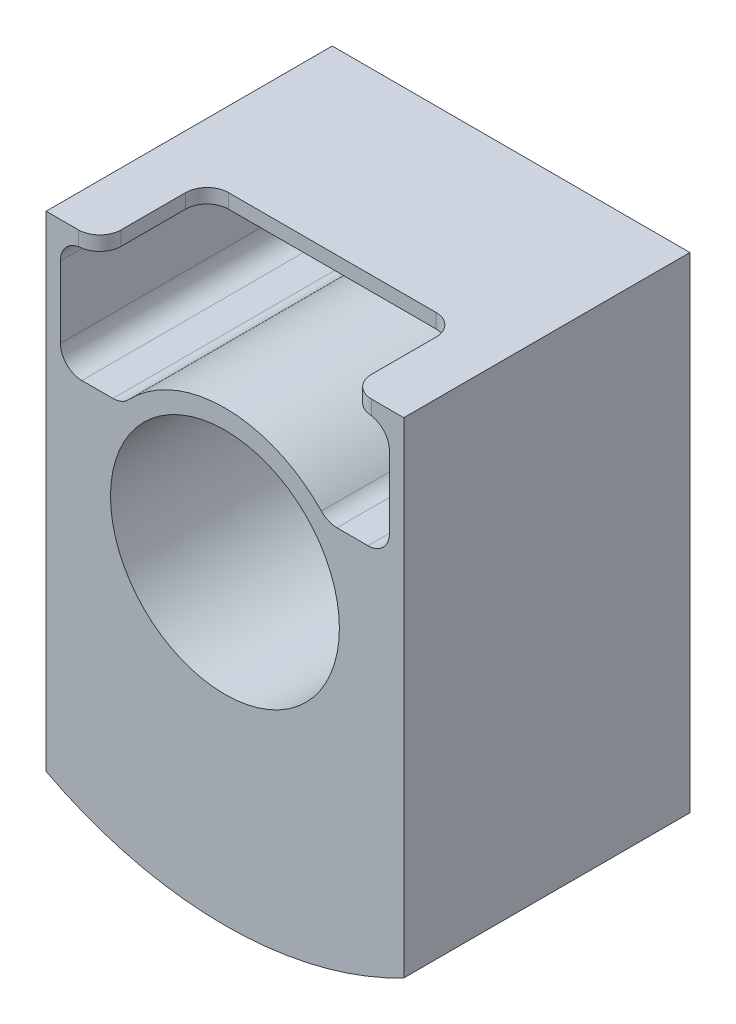
ISO-10303-21;
HEADER;
FILE_DESCRIPTION(('STEP AP214'),'2;1');
FILE_NAME('part.step','',(''),(''),'','','');
FILE_SCHEMA(('AUTOMOTIVE_DESIGN { 1 0 10303 214 1 1 1 1 }'));
ENDSEC;
DATA;
#1=APPLICATION_CONTEXT('core data for automotive mechanical design processes');
#2=APPLICATION_PROTOCOL_DEFINITION('international standard','automotive_design',2000,#1);
#3=PRODUCT_CONTEXT('',#1,'mechanical');
#4=PRODUCT('Part','Part','',(#3));
#5=PRODUCT_RELATED_PRODUCT_CATEGORY('part','',(#4));
#6=PRODUCT_DEFINITION_FORMATION('','',#4);
#7=PRODUCT_DEFINITION_CONTEXT('part definition',#1,'design');
#8=PRODUCT_DEFINITION('design','',#6,#7);
#9=PRODUCT_DEFINITION_SHAPE('','',#8);
#10=(LENGTH_UNIT() NAMED_UNIT(*) SI_UNIT(.MILLI.,.METRE.));
#11=(NAMED_UNIT(*) PLANE_ANGLE_UNIT() SI_UNIT($,.RADIAN.));
#12=(NAMED_UNIT(*) SI_UNIT($,.STERADIAN.) SOLID_ANGLE_UNIT());
#13=UNCERTAINTY_MEASURE_WITH_UNIT(LENGTH_MEASURE(1.E-05),#10,'distance_accuracy_value','');
#14=(GEOMETRIC_REPRESENTATION_CONTEXT(3) GLOBAL_UNCERTAINTY_ASSIGNED_CONTEXT((#13)) GLOBAL_UNIT_ASSIGNED_CONTEXT((#10,
#11,#12)) REPRESENTATION_CONTEXT('',''));
#15=CARTESIAN_POINT('',(0.,0.,0.));
#16=DIRECTION('',(0.,0.,1.));
#17=DIRECTION('',(1.,0.,0.));
#18=AXIS2_PLACEMENT_3D('',#15,#16,#17);
#19=CARTESIAN_POINT('',(-25.,0.,40.));
#20=DIRECTION('',(1.,0.,0.));
#21=DIRECTION('',(0.,1.,0.));
#22=AXIS2_PLACEMENT_3D('',#19,#20,#21);
#23=PLANE('',#22);
#24=DIRECTION('',(0.,-1.,0.));
#25=VECTOR('',#24,1.);
#26=CARTESIAN_POINT('',(-25.,0.,0.));
#27=LINE('',#26,#25);
#28=CARTESIAN_POINT('',(-25.,20.,0.));
#29=VERTEX_POINT('',#28);
#30=CARTESIAN_POINT('',(-25.,-47.8361853098677,0.));
#31=VERTEX_POINT('',#30);
#32=EDGE_CURVE('E225',#29,#31,#27,.T.);
#33=ORIENTED_EDGE('',*,*,#32,.T.);
#34=DIRECTION('',(0.,0.,-1.));
#35=VECTOR('',#34,1.);
#36=CARTESIAN_POINT('',(-25.,-47.8361853098677,40.));
#37=LINE('',#36,#35);
#38=CARTESIAN_POINT('',(-25.,-47.8361853098677,40.));
#39=VERTEX_POINT('',#38);
#40=EDGE_CURVE('E224',#39,#31,#37,.T.);
#41=ORIENTED_EDGE('',*,*,#40,.F.);
#42=DIRECTION('',(0.,-1.,0.));
#43=VECTOR('',#42,1.);
#44=CARTESIAN_POINT('',(-25.,0.,40.));
#45=LINE('',#44,#43);
#46=CARTESIAN_POINT('',(-25.,20.,40.));
#47=VERTEX_POINT('',#46);
#48=EDGE_CURVE('E206',#47,#39,#45,.T.);
#49=ORIENTED_EDGE('',*,*,#48,.F.);
#50=DIRECTION('',(0.,0.,-1.));
#51=VECTOR('',#50,1.);
#52=CARTESIAN_POINT('',(-25.,20.,40.));
#53=LINE('',#52,#51);
#54=EDGE_CURVE('E246',#47,#29,#53,.T.);
#55=ORIENTED_EDGE('',*,*,#54,.T.);
#56=EDGE_LOOP('',(#33,#41,#49,#55));
#57=FACE_BOUND('',#56,.T.);
#58=ADVANCED_FACE('F43',(#57),#23,.F.);
#59=CARTESIAN_POINT('',(0.,0.,40.));
#60=DIRECTION('',(0.,0.,-1.));
#61=DIRECTION('',(-1.,0.,0.));
#62=AXIS2_PLACEMENT_3D('',#59,#60,#61);
#63=CYLINDRICAL_SURFACE('',#62,53.975);
#64=CARTESIAN_POINT('',(0.,0.,0.));
#65=DIRECTION('',(0.,0.,1.));
#66=DIRECTION('',(1.,0.,0.));
#67=AXIS2_PLACEMENT_3D('',#64,#65,#66);
#68=CIRCLE('',#67,53.975);
#69=CARTESIAN_POINT('',(25.,-47.8361853098677,0.));
#70=VERTEX_POINT('',#69);
#71=EDGE_CURVE('E249',#31,#70,#68,.T.);
#72=ORIENTED_EDGE('',*,*,#71,.T.);
#73=DIRECTION('',(0.,0.,-1.));
#74=VECTOR('',#73,1.);
#75=CARTESIAN_POINT('',(25.,-47.8361853098677,40.));
#76=LINE('',#75,#74);
#77=CARTESIAN_POINT('',(25.,-47.8361853098677,40.));
#78=VERTEX_POINT('',#77);
#79=EDGE_CURVE('E231',#78,#70,#76,.T.);
#80=ORIENTED_EDGE('',*,*,#79,.F.);
#81=CARTESIAN_POINT('',(0.,0.,40.));
#82=DIRECTION('',(0.,0.,1.));
#83=DIRECTION('',(1.,0.,0.));
#84=AXIS2_PLACEMENT_3D('',#81,#82,#83);
#85=CIRCLE('',#84,53.975);
#86=EDGE_CURVE('E212',#39,#78,#85,.T.);
#87=ORIENTED_EDGE('',*,*,#86,.F.);
#88=ORIENTED_EDGE('',*,*,#40,.T.);
#89=EDGE_LOOP('',(#72,#80,#87,#88));
#90=FACE_BOUND('',#89,.T.);
#91=ADVANCED_FACE('F233',(#90),#63,.T.);
#92=CARTESIAN_POINT('',(25.,20.,40.));
#93=DIRECTION('',(-1.,0.,0.));
#94=DIRECTION('',(0.,-1.,0.));
#95=AXIS2_PLACEMENT_3D('',#92,#93,#94);
#96=PLANE('',#95);
#97=DIRECTION('',(0.,1.,0.));
#98=VECTOR('',#97,1.);
#99=CARTESIAN_POINT('',(25.,20.,0.));
#100=LINE('',#99,#98);
#101=CARTESIAN_POINT('',(25.,20.,0.));
#102=VERTEX_POINT('',#101);
#103=EDGE_CURVE('E253',#70,#102,#100,.T.);
#104=ORIENTED_EDGE('',*,*,#103,.T.);
#105=DIRECTION('',(0.,0.,-1.));
#106=VECTOR('',#105,1.);
#107=CARTESIAN_POINT('',(25.,20.,40.));
#108=LINE('',#107,#106);
#109=CARTESIAN_POINT('',(25.,20.,40.));
#110=VERTEX_POINT('',#109);
#111=EDGE_CURVE('E261',#110,#102,#108,.T.);
#112=ORIENTED_EDGE('',*,*,#111,.F.);
#113=DIRECTION('',(0.,1.,0.));
#114=VECTOR('',#113,1.);
#115=CARTESIAN_POINT('',(25.,0.,40.));
#116=LINE('',#115,#114);
#117=EDGE_CURVE('E237',#78,#110,#116,.T.);
#118=ORIENTED_EDGE('',*,*,#117,.F.);
#119=ORIENTED_EDGE('',*,*,#79,.T.);
#120=EDGE_LOOP('',(#104,#112,#118,#119));
#121=FACE_BOUND('',#120,.T.);
#122=ADVANCED_FACE('F553',(#121),#96,.F.);
#123=CARTESIAN_POINT('',(-25.,20.,40.));
#124=DIRECTION('',(0.,-1.,0.));
#125=DIRECTION('',(1.,0.,0.));
#126=AXIS2_PLACEMENT_3D('',#123,#124,#125);
#127=PLANE('',#126);
#128=DIRECTION('',(0.,0.,-1.));
#129=VECTOR('',#128,1.);
#130=CARTESIAN_POINT('',(17.5,20.,40.));
#131=LINE('',#130,#129);
#132=CARTESIAN_POINT('',(17.5,20.,37.));
#133=VERTEX_POINT('',#132);
#134=CARTESIAN_POINT('',(17.5,20.,28.));
#135=VERTEX_POINT('',#134);
#136=EDGE_CURVE('E455',#133,#135,#131,.T.);
#137=ORIENTED_EDGE('',*,*,#136,.F.);
#138=CARTESIAN_POINT('',(20.5,20.,37.));
#139=DIRECTION('',(0.,-1.,0.));
#140=DIRECTION('',(1.,0.,0.));
#141=AXIS2_PLACEMENT_3D('',#138,#139,#140);
#142=CIRCLE('',#141,3.);
#143=CARTESIAN_POINT('',(20.5,20.,40.));
#144=VERTEX_POINT('',#143);
#145=EDGE_CURVE('E366',#133,#144,#142,.F.);
#146=ORIENTED_EDGE('',*,*,#145,.T.);
#147=DIRECTION('',(-1.,0.,0.));
#148=VECTOR('',#147,1.);
#149=CARTESIAN_POINT('',(-25.,20.,40.));
#150=LINE('',#149,#148);
#151=EDGE_CURVE('E243',#110,#144,#150,.T.);
#152=ORIENTED_EDGE('',*,*,#151,.F.);
#153=ORIENTED_EDGE('',*,*,#111,.T.);
#154=DIRECTION('',(-1.,0.,0.));
#155=VECTOR('',#154,1.);
#156=CARTESIAN_POINT('',(-25.,20.,0.));
#157=LINE('',#156,#155);
#158=EDGE_CURVE('E221',#102,#29,#157,.T.);
#159=ORIENTED_EDGE('',*,*,#158,.T.);
#160=ORIENTED_EDGE('',*,*,#54,.F.);
#161=CARTESIAN_POINT('',(-20.5,20.,40.));
#162=VERTEX_POINT('',#161);
#163=EDGE_CURVE('E216',#162,#47,#150,.T.);
#164=ORIENTED_EDGE('',*,*,#163,.F.);
#165=CARTESIAN_POINT('',(-20.5,20.,37.));
#166=DIRECTION('',(0.,-1.,0.));
#167=DIRECTION('',(1.,0.,0.));
#168=AXIS2_PLACEMENT_3D('',#165,#166,#167);
#169=CIRCLE('',#168,3.);
#170=CARTESIAN_POINT('',(-17.5,20.,37.));
#171=VERTEX_POINT('',#170);
#172=EDGE_CURVE('E363',#162,#171,#169,.F.);
#173=ORIENTED_EDGE('',*,*,#172,.T.);
#174=DIRECTION('',(0.,0.,1.));
#175=VECTOR('',#174,1.);
#176=CARTESIAN_POINT('',(-17.5,20.,40.));
#177=LINE('',#176,#175);
#178=CARTESIAN_POINT('',(-17.5,20.,28.));
#179=VERTEX_POINT('',#178);
#180=EDGE_CURVE('E441',#179,#171,#177,.T.);
#181=ORIENTED_EDGE('',*,*,#180,.F.);
#182=CARTESIAN_POINT('',(-14.5,20.,28.));
#183=DIRECTION('',(0.,-1.,0.));
#184=DIRECTION('',(1.,0.,0.));
#185=AXIS2_PLACEMENT_3D('',#182,#183,#184);
#186=CIRCLE('',#185,3.);
#187=CARTESIAN_POINT('',(-14.5,20.,25.));
#188=VERTEX_POINT('',#187);
#189=EDGE_CURVE('E53',#179,#188,#186,.T.);
#190=ORIENTED_EDGE('',*,*,#189,.T.);
#191=DIRECTION('',(-1.,0.,0.));
#192=VECTOR('',#191,1.);
#193=CARTESIAN_POINT('',(-17.5,20.,25.));
#194=LINE('',#193,#192);
#195=CARTESIAN_POINT('',(14.5,20.,25.));
#196=VERTEX_POINT('',#195);
#197=EDGE_CURVE('E440',#196,#188,#194,.T.);
#198=ORIENTED_EDGE('',*,*,#197,.F.);
#199=CARTESIAN_POINT('',(14.5,20.,28.));
#200=DIRECTION('',(0.,-1.,0.));
#201=DIRECTION('',(1.,0.,0.));
#202=AXIS2_PLACEMENT_3D('',#199,#200,#201);
#203=CIRCLE('',#202,3.);
#204=EDGE_CURVE('E426',#196,#135,#203,.T.);
#205=ORIENTED_EDGE('',*,*,#204,.T.);
#206=EDGE_LOOP('',(#137,#146,#152,#153,#159,#160,#164,#173,#181,#190,#198,#205));
#207=FACE_BOUND('',#206,.T.);
#208=ADVANCED_FACE('F439',(#207),#127,.F.);
#209=CARTESIAN_POINT('',(0.,0.,40.));
#210=DIRECTION('',(0.,0.,1.));
#211=DIRECTION('',(1.,0.,0.));
#212=AXIS2_PLACEMENT_3D('',#209,#210,#211);
#213=PLANE('',#212);
#214=ORIENTED_EDGE('',*,*,#151,.T.);
#215=DIRECTION('',(0.,1.,0.));
#216=VECTOR('',#215,1.);
#217=CARTESIAN_POINT('',(20.5,18.,40.));
#218=LINE('',#217,#216);
#219=CARTESIAN_POINT('',(20.5,17.9580398915498,40.));
#220=VERTEX_POINT('',#219);
#221=EDGE_CURVE('E372',#144,#220,#218,.F.);
#222=ORIENTED_EDGE('',*,*,#221,.T.);
#223=CARTESIAN_POINT('',(20.,15.,40.));
#224=DIRECTION('',(0.,0.,1.));
#225=DIRECTION('',(1.,0.,0.));
#226=AXIS2_PLACEMENT_3D('',#223,#224,#225);
#227=CIRCLE('',#226,3.);
#228=CARTESIAN_POINT('',(23.,15.,40.));
#229=VERTEX_POINT('',#228);
#230=EDGE_CURVE('E308',#220,#229,#227,.F.);
#231=ORIENTED_EDGE('',*,*,#230,.T.);
#232=DIRECTION('',(0.,1.,0.));
#233=VECTOR('',#232,1.);
#234=CARTESIAN_POINT('',(23.,18.,40.));
#235=LINE('',#234,#233);
#236=CARTESIAN_POINT('',(23.,5.00000000000001,40.));
#237=VERTEX_POINT('',#236);
#238=EDGE_CURVE('E454',#237,#229,#235,.T.);
#239=ORIENTED_EDGE('',*,*,#238,.F.);
#240=CARTESIAN_POINT('',(20.,5.00000000000001,40.));
#241=DIRECTION('',(0.,0.,1.));
#242=DIRECTION('',(1.,0.,0.));
#243=AXIS2_PLACEMENT_3D('',#240,#241,#242);
#244=CIRCLE('',#243,3.);
#245=CARTESIAN_POINT('',(20.,2.00000000000001,40.));
#246=VERTEX_POINT('',#245);
#247=EDGE_CURVE('E314',#237,#246,#244,.F.);
#248=ORIENTED_EDGE('',*,*,#247,.T.);
#249=DIRECTION('',(1.,0.,0.));
#250=VECTOR('',#249,1.);
#251=CARTESIAN_POINT('',(23.,2.00000000000001,40.));
#252=LINE('',#251,#250);
#253=CARTESIAN_POINT('',(15.6553265744799,2.00000000000001,40.));
#254=VERTEX_POINT('',#253);
#255=EDGE_CURVE('E495',#254,#246,#252,.T.);
#256=ORIENTED_EDGE('',*,*,#255,.F.);
#257=CARTESIAN_POINT('',(15.6553265744799,5.00000000000001,40.));
#258=DIRECTION('',(0.,0.,1.));
#259=DIRECTION('',(1.,0.,0.));
#260=AXIS2_PLACEMENT_3D('',#257,#258,#259);
#261=CIRCLE('',#260,3.);
#262=CARTESIAN_POINT('',(13.4891531357993,2.92450183484671,40.));
#263=VERTEX_POINT('',#262);
#264=EDGE_CURVE('E320',#254,#263,#261,.F.);
#265=ORIENTED_EDGE('',*,*,#264,.T.);
#266=CARTESIAN_POINT('',(0.,-9.99999999999999,40.));
#267=DIRECTION('',(0.,0.,-1.));
#268=DIRECTION('',(1.,0.,0.));
#269=AXIS2_PLACEMENT_3D('',#266,#267,#268);
#270=CIRCLE('',#269,18.6815416922694);
#271=CARTESIAN_POINT('',(-13.4891531357993,2.92450183484671,40.));
#272=VERTEX_POINT('',#271);
#273=EDGE_CURVE('E486',#272,#263,#270,.T.);
#274=ORIENTED_EDGE('',*,*,#273,.F.);
#275=CARTESIAN_POINT('',(-15.6553265744799,5.,40.));
#276=DIRECTION('',(0.,0.,1.));
#277=DIRECTION('',(1.,0.,0.));
#278=AXIS2_PLACEMENT_3D('',#275,#276,#277);
#279=CIRCLE('',#278,3.);
#280=CARTESIAN_POINT('',(-15.6553265744799,2.00000000000001,40.));
#281=VERTEX_POINT('',#280);
#282=EDGE_CURVE('E326',#272,#281,#279,.F.);
#283=ORIENTED_EDGE('',*,*,#282,.T.);
#284=DIRECTION('',(1.,0.,0.));
#285=VECTOR('',#284,1.);
#286=CARTESIAN_POINT('',(-23.,2.00000000000001,40.));
#287=LINE('',#286,#285);
#288=CARTESIAN_POINT('',(-20.,2.00000000000001,40.));
#289=VERTEX_POINT('',#288);
#290=EDGE_CURVE('E481',#289,#281,#287,.T.);
#291=ORIENTED_EDGE('',*,*,#290,.F.);
#292=CARTESIAN_POINT('',(-20.,5.00000000000001,40.));
#293=DIRECTION('',(0.,0.,1.));
#294=DIRECTION('',(1.,0.,0.));
#295=AXIS2_PLACEMENT_3D('',#292,#293,#294);
#296=CIRCLE('',#295,3.);
#297=CARTESIAN_POINT('',(-23.,5.,40.));
#298=VERTEX_POINT('',#297);
#299=EDGE_CURVE('E332',#289,#298,#296,.F.);
#300=ORIENTED_EDGE('',*,*,#299,.T.);
#301=DIRECTION('',(0.,-1.,0.));
#302=VECTOR('',#301,1.);
#303=CARTESIAN_POINT('',(-23.,18.,40.));
#304=LINE('',#303,#302);
#305=CARTESIAN_POINT('',(-23.,15.,40.));
#306=VERTEX_POINT('',#305);
#307=EDGE_CURVE('E476',#306,#298,#304,.T.);
#308=ORIENTED_EDGE('',*,*,#307,.F.);
#309=CARTESIAN_POINT('',(-20.,15.,40.));
#310=DIRECTION('',(0.,0.,1.));
#311=DIRECTION('',(1.,0.,0.));
#312=AXIS2_PLACEMENT_3D('',#309,#310,#311);
#313=CIRCLE('',#312,3.);
#314=CARTESIAN_POINT('',(-20.5,17.9580398915498,40.));
#315=VERTEX_POINT('',#314);
#316=EDGE_CURVE('E338',#306,#315,#313,.F.);
#317=ORIENTED_EDGE('',*,*,#316,.T.);
#318=DIRECTION('',(0.,1.,0.));
#319=VECTOR('',#318,1.);
#320=CARTESIAN_POINT('',(-20.5,20.,40.));
#321=LINE('',#320,#319);
#322=EDGE_CURVE('E369',#315,#162,#321,.T.);
#323=ORIENTED_EDGE('',*,*,#322,.T.);
#324=ORIENTED_EDGE('',*,*,#163,.T.);
#325=ORIENTED_EDGE('',*,*,#48,.T.);
#326=ORIENTED_EDGE('',*,*,#86,.T.);
#327=ORIENTED_EDGE('',*,*,#117,.T.);
#328=EDGE_LOOP('',(#214,#222,#231,#239,#248,#256,#265,#274,#283,#291,#300,#308,#317,#323,#324,
#325,#326,#327));
#329=FACE_BOUND('',#328,.T.);
#330=CARTESIAN_POINT('',(0.,-9.99999999999999,40.));
#331=DIRECTION('',(0.,0.,1.));
#332=DIRECTION('',(1.,0.,0.));
#333=AXIS2_PLACEMENT_3D('',#330,#331,#332);
#334=CIRCLE('',#333,16.);
#335=CARTESIAN_POINT('',(16.,-9.99999999999999,40.));
#336=VERTEX_POINT('',#335);
#337=EDGE_CURVE('E502',#336,#336,#334,.T.);
#338=ORIENTED_EDGE('',*,*,#337,.F.);
#339=EDGE_LOOP('',(#338));
#340=FACE_BOUND('',#339,.T.);
#341=ADVANCED_FACE('F209',(#329,#340),#213,.T.);
#342=CARTESIAN_POINT('',(0.,0.,0.));
#343=DIRECTION('',(0.,0.,1.));
#344=DIRECTION('',(1.,0.,0.));
#345=AXIS2_PLACEMENT_3D('',#342,#343,#344);
#346=PLANE('',#345);
#347=CARTESIAN_POINT('',(0.,-9.99999999999999,0.));
#348=DIRECTION('',(0.,0.,-1.));
#349=DIRECTION('',(1.,0.,0.));
#350=AXIS2_PLACEMENT_3D('',#347,#348,#349);
#351=CIRCLE('',#350,18.6815416922694);
#352=CARTESIAN_POINT('',(-13.4891531357993,2.92450183484671,0.));
#353=VERTEX_POINT('',#352);
#354=CARTESIAN_POINT('',(13.4891531357993,2.92450183484671,0.));
#355=VERTEX_POINT('',#354);
#356=EDGE_CURVE('E510',#353,#355,#351,.T.);
#357=ORIENTED_EDGE('',*,*,#356,.T.);
#358=CARTESIAN_POINT('',(15.6553265744799,5.00000000000001,0.));
#359=DIRECTION('',(0.,0.,1.));
#360=DIRECTION('',(1.,0.,0.));
#361=AXIS2_PLACEMENT_3D('',#358,#359,#360);
#362=CIRCLE('',#361,3.);
#363=CARTESIAN_POINT('',(15.6553265744799,2.00000000000001,0.));
#364=VERTEX_POINT('',#363);
#365=EDGE_CURVE('E323',#355,#364,#362,.T.);
#366=ORIENTED_EDGE('',*,*,#365,.T.);
#367=DIRECTION('',(1.,0.,0.));
#368=VECTOR('',#367,1.);
#369=CARTESIAN_POINT('',(23.,2.00000000000001,0.));
#370=LINE('',#369,#368);
#371=CARTESIAN_POINT('',(20.,2.00000000000001,0.));
#372=VERTEX_POINT('',#371);
#373=EDGE_CURVE('E505',#364,#372,#370,.T.);
#374=ORIENTED_EDGE('',*,*,#373,.T.);
#375=CARTESIAN_POINT('',(20.,5.00000000000001,0.));
#376=DIRECTION('',(0.,0.,1.));
#377=DIRECTION('',(1.,0.,0.));
#378=AXIS2_PLACEMENT_3D('',#375,#376,#377);
#379=CIRCLE('',#378,3.);
#380=CARTESIAN_POINT('',(23.,5.00000000000001,0.));
#381=VERTEX_POINT('',#380);
#382=EDGE_CURVE('E317',#372,#381,#379,.T.);
#383=ORIENTED_EDGE('',*,*,#382,.T.);
#384=DIRECTION('',(0.,1.,0.));
#385=VECTOR('',#384,1.);
#386=CARTESIAN_POINT('',(23.,18.,0.));
#387=LINE('',#386,#385);
#388=CARTESIAN_POINT('',(23.,15.,0.));
#389=VERTEX_POINT('',#388);
#390=EDGE_CURVE('E499',#381,#389,#387,.T.);
#391=ORIENTED_EDGE('',*,*,#390,.T.);
#392=CARTESIAN_POINT('',(20.,15.,0.));
#393=DIRECTION('',(0.,0.,1.));
#394=DIRECTION('',(1.,0.,0.));
#395=AXIS2_PLACEMENT_3D('',#392,#393,#394);
#396=CIRCLE('',#395,3.);
#397=CARTESIAN_POINT('',(20.,18.,0.));
#398=VERTEX_POINT('',#397);
#399=EDGE_CURVE('E311',#389,#398,#396,.T.);
#400=ORIENTED_EDGE('',*,*,#399,.T.);
#401=DIRECTION('',(-1.,0.,0.));
#402=VECTOR('',#401,1.);
#403=CARTESIAN_POINT('',(-23.,18.,0.));
#404=LINE('',#403,#402);
#405=CARTESIAN_POINT('',(-20.,18.,0.));
#406=VERTEX_POINT('',#405);
#407=EDGE_CURVE('E526',#398,#406,#404,.T.);
#408=ORIENTED_EDGE('',*,*,#407,.T.);
#409=CARTESIAN_POINT('',(-20.,15.,0.));
#410=DIRECTION('',(0.,0.,1.));
#411=DIRECTION('',(1.,0.,0.));
#412=AXIS2_PLACEMENT_3D('',#409,#410,#411);
#413=CIRCLE('',#412,3.);
#414=CARTESIAN_POINT('',(-23.,15.,0.));
#415=VERTEX_POINT('',#414);
#416=EDGE_CURVE('E342',#406,#415,#413,.T.);
#417=ORIENTED_EDGE('',*,*,#416,.T.);
#418=DIRECTION('',(0.,-1.,0.));
#419=VECTOR('',#418,1.);
#420=CARTESIAN_POINT('',(-23.,18.,0.));
#421=LINE('',#420,#419);
#422=CARTESIAN_POINT('',(-23.,5.,0.));
#423=VERTEX_POINT('',#422);
#424=EDGE_CURVE('E522',#415,#423,#421,.T.);
#425=ORIENTED_EDGE('',*,*,#424,.T.);
#426=CARTESIAN_POINT('',(-20.,5.00000000000001,0.));
#427=DIRECTION('',(0.,0.,1.));
#428=DIRECTION('',(1.,0.,0.));
#429=AXIS2_PLACEMENT_3D('',#426,#427,#428);
#430=CIRCLE('',#429,3.);
#431=CARTESIAN_POINT('',(-20.,2.00000000000001,0.));
#432=VERTEX_POINT('',#431);
#433=EDGE_CURVE('E335',#423,#432,#430,.T.);
#434=ORIENTED_EDGE('',*,*,#433,.T.);
#435=DIRECTION('',(1.,0.,0.));
#436=VECTOR('',#435,1.);
#437=CARTESIAN_POINT('',(-23.,2.00000000000001,0.));
#438=LINE('',#437,#436);
#439=CARTESIAN_POINT('',(-15.6553265744799,2.00000000000001,0.));
#440=VERTEX_POINT('',#439);
#441=EDGE_CURVE('E516',#432,#440,#438,.T.);
#442=ORIENTED_EDGE('',*,*,#441,.T.);
#443=CARTESIAN_POINT('',(-15.6553265744799,5.,0.));
#444=DIRECTION('',(0.,0.,1.));
#445=DIRECTION('',(1.,0.,0.));
#446=AXIS2_PLACEMENT_3D('',#443,#444,#445);
#447=CIRCLE('',#446,3.);
#448=EDGE_CURVE('E329',#440,#353,#447,.T.);
#449=ORIENTED_EDGE('',*,*,#448,.T.);
#450=EDGE_LOOP('',(#357,#366,#374,#383,#391,#400,#408,#417,#425,#434,#442,#449));
#451=FACE_BOUND('',#450,.T.);
#452=CARTESIAN_POINT('',(0.,-9.99999999999999,0.));
#453=DIRECTION('',(0.,0.,1.));
#454=DIRECTION('',(1.,0.,0.));
#455=AXIS2_PLACEMENT_3D('',#452,#453,#454);
#456=CIRCLE('',#455,16.);
#457=CARTESIAN_POINT('',(16.,-9.99999999999999,0.));
#458=VERTEX_POINT('',#457);
#459=EDGE_CURVE('E250',#458,#458,#456,.T.);
#460=ORIENTED_EDGE('',*,*,#459,.T.);
#461=EDGE_LOOP('',(#460));
#462=FACE_BOUND('',#461,.T.);
#463=ORIENTED_EDGE('',*,*,#32,.F.);
#464=ORIENTED_EDGE('',*,*,#158,.F.);
#465=ORIENTED_EDGE('',*,*,#103,.F.);
#466=ORIENTED_EDGE('',*,*,#71,.F.);
#467=EDGE_LOOP('',(#463,#464,#465,#466));
#468=FACE_BOUND('',#467,.T.);
#469=ADVANCED_FACE('F556',(#451,#462,#468),#346,.F.);
#470=CARTESIAN_POINT('',(0.,-9.99999999999999,0.));
#471=DIRECTION('',(0.,0.,1.));
#472=DIRECTION('',(1.,0.,0.));
#473=AXIS2_PLACEMENT_3D('',#470,#471,#472);
#474=CYLINDRICAL_SURFACE('',#473,16.);
#475=ORIENTED_EDGE('',*,*,#459,.F.);
#476=EDGE_LOOP('',(#475));
#477=FACE_BOUND('',#476,.T.);
#478=ORIENTED_EDGE('',*,*,#337,.T.);
#479=EDGE_LOOP('',(#478));
#480=FACE_BOUND('',#479,.T.);
#481=ADVANCED_FACE('F558',(#477,#480),#474,.F.);
#482=CARTESIAN_POINT('',(23.,18.,0.));
#483=DIRECTION('',(1.,0.,0.));
#484=DIRECTION('',(0.,1.,0.));
#485=AXIS2_PLACEMENT_3D('',#482,#483,#484);
#486=PLANE('',#485);
#487=ORIENTED_EDGE('',*,*,#238,.T.);
#488=DIRECTION('',(0.,0.,1.));
#489=VECTOR('',#488,1.);
#490=CARTESIAN_POINT('',(23.,15.,0.));
#491=LINE('',#490,#489);
#492=EDGE_CURVE('E277',#229,#389,#491,.F.);
#493=ORIENTED_EDGE('',*,*,#492,.T.);
#494=ORIENTED_EDGE('',*,*,#390,.F.);
#495=DIRECTION('',(0.,0.,1.));
#496=VECTOR('',#495,1.);
#497=CARTESIAN_POINT('',(23.,5.00000000000001,40.));
#498=LINE('',#497,#496);
#499=EDGE_CURVE('E273',#381,#237,#498,.T.);
#500=ORIENTED_EDGE('',*,*,#499,.T.);
#501=EDGE_LOOP('',(#487,#493,#494,#500));
#502=FACE_BOUND('',#501,.T.);
#503=ADVANCED_FACE('F564',(#502),#486,.F.);
#504=CARTESIAN_POINT('',(23.,2.00000000000001,0.));
#505=DIRECTION('',(0.,-1.,0.));
#506=DIRECTION('',(0.,0.,-1.));
#507=AXIS2_PLACEMENT_3D('',#504,#505,#506);
#508=PLANE('',#507);
#509=ORIENTED_EDGE('',*,*,#255,.T.);
#510=DIRECTION('',(0.,0.,1.));
#511=VECTOR('',#510,1.);
#512=CARTESIAN_POINT('',(20.,2.00000000000001,0.));
#513=LINE('',#512,#511);
#514=EDGE_CURVE('E284',#246,#372,#513,.F.);
#515=ORIENTED_EDGE('',*,*,#514,.T.);
#516=ORIENTED_EDGE('',*,*,#373,.F.);
#517=DIRECTION('',(0.,0.,-1.));
#518=VECTOR('',#517,1.);
#519=CARTESIAN_POINT('',(15.6553265744799,2.00000000000001,40.));
#520=LINE('',#519,#518);
#521=EDGE_CURVE('E280',#364,#254,#520,.F.);
#522=ORIENTED_EDGE('',*,*,#521,.T.);
#523=EDGE_LOOP('',(#509,#515,#516,#522));
#524=FACE_BOUND('',#523,.T.);
#525=ADVANCED_FACE('F734',(#524),#508,.F.);
#526=CARTESIAN_POINT('',(0.,-9.99999999999999,0.));
#527=DIRECTION('',(0.,0.,1.));
#528=DIRECTION('',(1.,0.,0.));
#529=AXIS2_PLACEMENT_3D('',#526,#527,#528);
#530=CYLINDRICAL_SURFACE('',#529,18.6815416922694);
#531=ORIENTED_EDGE('',*,*,#273,.T.);
#532=DIRECTION('',(0.,0.,1.));
#533=VECTOR('',#532,1.);
#534=CARTESIAN_POINT('',(13.4891531357993,2.92450183484671,0.));
#535=LINE('',#534,#533);
#536=EDGE_CURVE('E291',#263,#355,#535,.F.);
#537=ORIENTED_EDGE('',*,*,#536,.T.);
#538=ORIENTED_EDGE('',*,*,#356,.F.);
#539=DIRECTION('',(0.,0.,1.));
#540=VECTOR('',#539,1.);
#541=CARTESIAN_POINT('',(-13.4891531357993,2.92450183484671,0.));
#542=LINE('',#541,#540);
#543=EDGE_CURVE('E287',#353,#272,#542,.T.);
#544=ORIENTED_EDGE('',*,*,#543,.T.);
#545=EDGE_LOOP('',(#531,#537,#538,#544));
#546=FACE_BOUND('',#545,.T.);
#547=ADVANCED_FACE('F724',(#546),#530,.T.);
#548=CARTESIAN_POINT('',(-23.,2.00000000000001,0.));
#549=DIRECTION('',(0.,-1.,0.));
#550=DIRECTION('',(0.,0.,-1.));
#551=AXIS2_PLACEMENT_3D('',#548,#549,#550);
#552=PLANE('',#551);
#553=ORIENTED_EDGE('',*,*,#290,.T.);
#554=DIRECTION('',(0.,0.,-1.));
#555=VECTOR('',#554,1.);
#556=CARTESIAN_POINT('',(-15.6553265744799,2.00000000000001,0.));
#557=LINE('',#556,#555);
#558=EDGE_CURVE('E298',#281,#440,#557,.T.);
#559=ORIENTED_EDGE('',*,*,#558,.T.);
#560=ORIENTED_EDGE('',*,*,#441,.F.);
#561=DIRECTION('',(0.,0.,1.));
#562=VECTOR('',#561,1.);
#563=CARTESIAN_POINT('',(-20.,2.00000000000001,40.));
#564=LINE('',#563,#562);
#565=EDGE_CURVE('E294',#432,#289,#564,.T.);
#566=ORIENTED_EDGE('',*,*,#565,.T.);
#567=EDGE_LOOP('',(#553,#559,#560,#566));
#568=FACE_BOUND('',#567,.T.);
#569=ADVANCED_FACE('F715',(#568),#552,.F.);
#570=CARTESIAN_POINT('',(-23.,18.,0.));
#571=DIRECTION('',(-1.,0.,0.));
#572=DIRECTION('',(0.,-1.,0.));
#573=AXIS2_PLACEMENT_3D('',#570,#571,#572);
#574=PLANE('',#573);
#575=ORIENTED_EDGE('',*,*,#307,.T.);
#576=DIRECTION('',(0.,0.,1.));
#577=VECTOR('',#576,1.);
#578=CARTESIAN_POINT('',(-23.,5.,0.));
#579=LINE('',#578,#577);
#580=EDGE_CURVE('E305',#298,#423,#579,.F.);
#581=ORIENTED_EDGE('',*,*,#580,.T.);
#582=ORIENTED_EDGE('',*,*,#424,.F.);
#583=DIRECTION('',(0.,0.,1.));
#584=VECTOR('',#583,1.);
#585=CARTESIAN_POINT('',(-23.,15.,40.));
#586=LINE('',#585,#584);
#587=EDGE_CURVE('E301',#415,#306,#586,.T.);
#588=ORIENTED_EDGE('',*,*,#587,.T.);
#589=EDGE_LOOP('',(#575,#581,#582,#588));
#590=FACE_BOUND('',#589,.T.);
#591=ADVANCED_FACE('F599',(#590),#574,.F.);
#592=CARTESIAN_POINT('',(-23.,18.,0.));
#593=DIRECTION('',(0.,1.,0.));
#594=DIRECTION('',(-1.,0.,0.));
#595=AXIS2_PLACEMENT_3D('',#592,#593,#594);
#596=PLANE('',#595);
#597=DIRECTION('',(0.,0.,1.));
#598=VECTOR('',#597,1.);
#599=CARTESIAN_POINT('',(20.,18.,40.));
#600=LINE('',#599,#598);
#601=CARTESIAN_POINT('',(20.,18.,39.9580398915498));
#602=VERTEX_POINT('',#601);
#603=EDGE_CURVE('E269',#398,#602,#600,.T.);
#604=ORIENTED_EDGE('',*,*,#603,.T.);
#605=CARTESIAN_POINT('',(20.5,18.,37.));
#606=DIRECTION('',(0.,1.,0.));
#607=DIRECTION('',(-1.,0.,0.));
#608=AXIS2_PLACEMENT_3D('',#605,#606,#607);
#609=CIRCLE('',#608,3.);
#610=CARTESIAN_POINT('',(17.5,18.,37.));
#611=VERTEX_POINT('',#610);
#612=EDGE_CURVE('E460',#602,#611,#609,.F.);
#613=ORIENTED_EDGE('',*,*,#612,.T.);
#614=DIRECTION('',(0.,0.,-1.));
#615=VECTOR('',#614,1.);
#616=CARTESIAN_POINT('',(17.5,18.,0.));
#617=LINE('',#616,#615);
#618=CARTESIAN_POINT('',(17.5,18.,28.));
#619=VERTEX_POINT('',#618);
#620=EDGE_CURVE('E345',#611,#619,#617,.T.);
#621=ORIENTED_EDGE('',*,*,#620,.T.);
#622=CARTESIAN_POINT('',(14.5,18.,28.));
#623=DIRECTION('',(0.,1.,0.));
#624=DIRECTION('',(-1.,0.,0.));
#625=AXIS2_PLACEMENT_3D('',#622,#623,#624);
#626=CIRCLE('',#625,3.);
#627=CARTESIAN_POINT('',(14.5,18.,25.));
#628=VERTEX_POINT('',#627);
#629=EDGE_CURVE('E431',#619,#628,#626,.T.);
#630=ORIENTED_EDGE('',*,*,#629,.T.);
#631=DIRECTION('',(-1.,0.,0.));
#632=VECTOR('',#631,1.);
#633=CARTESIAN_POINT('',(-23.,18.,25.));
#634=LINE('',#633,#632);
#635=CARTESIAN_POINT('',(-14.5,18.,25.));
#636=VERTEX_POINT('',#635);
#637=EDGE_CURVE('E349',#628,#636,#634,.T.);
#638=ORIENTED_EDGE('',*,*,#637,.T.);
#639=CARTESIAN_POINT('',(-14.5,18.,28.));
#640=DIRECTION('',(0.,1.,0.));
#641=DIRECTION('',(-1.,0.,0.));
#642=AXIS2_PLACEMENT_3D('',#639,#640,#641);
#643=CIRCLE('',#642,3.);
#644=CARTESIAN_POINT('',(-17.5,18.,28.));
#645=VERTEX_POINT('',#644);
#646=EDGE_CURVE('E11',#636,#645,#643,.T.);
#647=ORIENTED_EDGE('',*,*,#646,.T.);
#648=DIRECTION('',(0.,0.,1.));
#649=VECTOR('',#648,1.);
#650=CARTESIAN_POINT('',(-17.5,18.,0.));
#651=LINE('',#650,#649);
#652=CARTESIAN_POINT('',(-17.5,18.,37.));
#653=VERTEX_POINT('',#652);
#654=EDGE_CURVE('E353',#645,#653,#651,.T.);
#655=ORIENTED_EDGE('',*,*,#654,.T.);
#656=CARTESIAN_POINT('',(-20.5,18.,37.));
#657=DIRECTION('',(0.,1.,0.));
#658=DIRECTION('',(-1.,0.,0.));
#659=AXIS2_PLACEMENT_3D('',#656,#657,#658);
#660=CIRCLE('',#659,3.);
#661=CARTESIAN_POINT('',(-20.,18.,39.9580398915498));
#662=VERTEX_POINT('',#661);
#663=EDGE_CURVE('E60',#653,#662,#660,.F.);
#664=ORIENTED_EDGE('',*,*,#663,.T.);
#665=DIRECTION('',(0.,0.,1.));
#666=VECTOR('',#665,1.);
#667=CARTESIAN_POINT('',(-20.,18.,0.));
#668=LINE('',#667,#666);
#669=EDGE_CURVE('E230',#662,#406,#668,.F.);
#670=ORIENTED_EDGE('',*,*,#669,.T.);
#671=ORIENTED_EDGE('',*,*,#407,.F.);
#672=EDGE_LOOP('',(#604,#613,#621,#630,#638,#647,#655,#664,#670,#671));
#673=FACE_BOUND('',#672,.T.);
#674=ADVANCED_FACE('F395',(#673),#596,.F.);
#675=CARTESIAN_POINT('',(20.,15.,0.));
#676=DIRECTION('',(0.,0.,-1.));
#677=DIRECTION('',(-1.,0.,0.));
#678=AXIS2_PLACEMENT_3D('',#675,#676,#677);
#679=CYLINDRICAL_SURFACE('',#678,3.);
#680=ORIENTED_EDGE('',*,*,#230,.F.);
#681=CARTESIAN_POINT('',(20.5,17.9580398915498,40.));
#682=CARTESIAN_POINT('',(20.4584594430555,17.9650641757042,40.0000025812563));
#683=CARTESIAN_POINT('',(20.4167694528085,17.971208357173,39.9991371821036));
#684=CARTESIAN_POINT('',(20.3333859621343,17.9817125143252,39.9956587052855));
#685=CARTESIAN_POINT('',(20.2916929810671,17.9860786380353,39.9930517335154));
#686=CARTESIAN_POINT('',(20.2083070189329,17.9930517335154,39.9860786380353));
#687=CARTESIAN_POINT('',(20.1666140378657,17.9956587052855,39.9817125143252));
#688=CARTESIAN_POINT('',(20.0832305471915,17.9991371821036,39.971208357173));
#689=CARTESIAN_POINT('',(20.0415405569445,18.0000025812563,39.9650641757042));
#690=CARTESIAN_POINT('',(20.,18.,39.9580398915498));
#691=B_SPLINE_CURVE_WITH_KNOTS('',3,(#681,#682,#683,#684,#685,#686,#687,#688,#689,#690),
.UNSPECIFIED.,.F.,.F.,(4,2,2,2,4),(0.,0.126373343615947,0.252305935630919,0.378238527645888,
0.504611871261836),.UNSPECIFIED.);
#692=EDGE_CURVE('E375',#220,#602,#691,.T.);
#693=ORIENTED_EDGE('',*,*,#692,.T.);
#694=ORIENTED_EDGE('',*,*,#603,.F.);
#695=ORIENTED_EDGE('',*,*,#399,.F.);
#696=ORIENTED_EDGE('',*,*,#492,.F.);
#697=EDGE_LOOP('',(#680,#693,#694,#695,#696));
#698=FACE_BOUND('',#697,.T.);
#699=ADVANCED_FACE('F389',(#698),#679,.F.);
#700=CARTESIAN_POINT('',(20.,5.00000000000001,0.));
#701=DIRECTION('',(0.,0.,-1.));
#702=DIRECTION('',(-1.,0.,0.));
#703=AXIS2_PLACEMENT_3D('',#700,#701,#702);
#704=CYLINDRICAL_SURFACE('',#703,3.);
#705=ORIENTED_EDGE('',*,*,#382,.F.);
#706=ORIENTED_EDGE('',*,*,#514,.F.);
#707=ORIENTED_EDGE('',*,*,#247,.F.);
#708=ORIENTED_EDGE('',*,*,#499,.F.);
#709=EDGE_LOOP('',(#705,#706,#707,#708));
#710=FACE_BOUND('',#709,.T.);
#711=ADVANCED_FACE('F394',(#710),#704,.F.);
#712=CARTESIAN_POINT('',(15.6553265744799,5.00000000000001,0.));
#713=DIRECTION('',(0.,0.,1.));
#714=DIRECTION('',(1.,0.,0.));
#715=AXIS2_PLACEMENT_3D('',#712,#713,#714);
#716=CYLINDRICAL_SURFACE('',#715,3.);
#717=ORIENTED_EDGE('',*,*,#365,.F.);
#718=ORIENTED_EDGE('',*,*,#536,.F.);
#719=ORIENTED_EDGE('',*,*,#264,.F.);
#720=ORIENTED_EDGE('',*,*,#521,.F.);
#721=EDGE_LOOP('',(#717,#718,#719,#720));
#722=FACE_BOUND('',#721,.T.);
#723=ADVANCED_FACE('F400',(#722),#716,.F.);
#724=CARTESIAN_POINT('',(-15.6553265744799,5.,0.));
#725=DIRECTION('',(0.,0.,1.));
#726=DIRECTION('',(1.,0.,0.));
#727=AXIS2_PLACEMENT_3D('',#724,#725,#726);
#728=CYLINDRICAL_SURFACE('',#727,3.);
#729=ORIENTED_EDGE('',*,*,#448,.F.);
#730=ORIENTED_EDGE('',*,*,#558,.F.);
#731=ORIENTED_EDGE('',*,*,#282,.F.);
#732=ORIENTED_EDGE('',*,*,#543,.F.);
#733=EDGE_LOOP('',(#729,#730,#731,#732));
#734=FACE_BOUND('',#733,.T.);
#735=ADVANCED_FACE('F404',(#734),#728,.F.);
#736=CARTESIAN_POINT('',(-20.,5.00000000000001,0.));
#737=DIRECTION('',(0.,0.,-1.));
#738=DIRECTION('',(-1.,0.,0.));
#739=AXIS2_PLACEMENT_3D('',#736,#737,#738);
#740=CYLINDRICAL_SURFACE('',#739,3.);
#741=ORIENTED_EDGE('',*,*,#433,.F.);
#742=ORIENTED_EDGE('',*,*,#580,.F.);
#743=ORIENTED_EDGE('',*,*,#299,.F.);
#744=ORIENTED_EDGE('',*,*,#565,.F.);
#745=EDGE_LOOP('',(#741,#742,#743,#744));
#746=FACE_BOUND('',#745,.T.);
#747=ADVANCED_FACE('F408',(#746),#740,.F.);
#748=CARTESIAN_POINT('',(-20.,15.,0.));
#749=DIRECTION('',(0.,0.,-1.));
#750=DIRECTION('',(-1.,0.,0.));
#751=AXIS2_PLACEMENT_3D('',#748,#749,#750);
#752=CYLINDRICAL_SURFACE('',#751,3.);
#753=ORIENTED_EDGE('',*,*,#669,.F.);
#754=CARTESIAN_POINT('',(-20.,18.,39.9580398915498));
#755=CARTESIAN_POINT('',(-20.0415405569445,18.0000025812563,39.9650641757042));
#756=CARTESIAN_POINT('',(-20.0832305471915,17.9991371821036,39.971208357173));
#757=CARTESIAN_POINT('',(-20.1666140378657,17.9956587052855,39.9817125143252));
#758=CARTESIAN_POINT('',(-20.2083070189329,17.9930517335154,39.9860786380353));
#759=CARTESIAN_POINT('',(-20.2916929810671,17.9860786380353,39.9930517335154));
#760=CARTESIAN_POINT('',(-20.3333859621343,17.9817125143252,39.9956587052855));
#761=CARTESIAN_POINT('',(-20.4167694528085,17.971208357173,39.9991371821036));
#762=CARTESIAN_POINT('',(-20.4584594430556,17.9650641757042,40.0000025812563));
#763=CARTESIAN_POINT('',(-20.5,17.9580398915498,40.));
#764=B_SPLINE_CURVE_WITH_KNOTS('',3,(#754,#755,#756,#757,#758,#759,#760,#761,#762,#763),
.UNSPECIFIED.,.F.,.F.,(4,2,2,2,4),(0.,0.126373343615954,0.252305935630927,0.378238527645898,
0.504611871261849),.UNSPECIFIED.);
#765=EDGE_CURVE('E418',#662,#315,#764,.T.);
#766=ORIENTED_EDGE('',*,*,#765,.T.);
#767=ORIENTED_EDGE('',*,*,#316,.F.);
#768=ORIENTED_EDGE('',*,*,#587,.F.);
#769=ORIENTED_EDGE('',*,*,#416,.F.);
#770=EDGE_LOOP('',(#753,#766,#767,#768,#769));
#771=FACE_BOUND('',#770,.T.);
#772=ADVANCED_FACE('F411',(#771),#752,.F.);
#773=CARTESIAN_POINT('',(-17.5,10.,40.));
#774=DIRECTION('',(-1.,0.,0.));
#775=DIRECTION('',(0.,-1.,0.));
#776=AXIS2_PLACEMENT_3D('',#773,#774,#775);
#777=PLANE('',#776);
#778=ORIENTED_EDGE('',*,*,#654,.F.);
#779=DIRECTION('',(0.,1.,0.));
#780=VECTOR('',#779,1.);
#781=CARTESIAN_POINT('',(-17.5,20.,28.));
#782=LINE('',#781,#780);
#783=EDGE_CURVE('E427',#645,#179,#782,.T.);
#784=ORIENTED_EDGE('',*,*,#783,.T.);
#785=ORIENTED_EDGE('',*,*,#180,.T.);
#786=DIRECTION('',(0.,1.,0.));
#787=VECTOR('',#786,1.);
#788=CARTESIAN_POINT('',(-17.5,18.,37.));
#789=LINE('',#788,#787);
#790=EDGE_CURVE('E68',#171,#653,#789,.F.);
#791=ORIENTED_EDGE('',*,*,#790,.T.);
#792=EDGE_LOOP('',(#778,#784,#785,#791));
#793=FACE_BOUND('',#792,.T.);
#794=ADVANCED_FACE('F415',(#793),#777,.F.);
#795=CARTESIAN_POINT('',(-17.5,10.,25.));
#796=DIRECTION('',(0.,0.,-1.));
#797=DIRECTION('',(-1.,0.,0.));
#798=AXIS2_PLACEMENT_3D('',#795,#796,#797);
#799=PLANE('',#798);
#800=ORIENTED_EDGE('',*,*,#637,.F.);
#801=DIRECTION('',(0.,1.,0.));
#802=VECTOR('',#801,1.);
#803=CARTESIAN_POINT('',(14.5,20.,25.));
#804=LINE('',#803,#802);
#805=EDGE_CURVE('E452',#628,#196,#804,.T.);
#806=ORIENTED_EDGE('',*,*,#805,.T.);
#807=ORIENTED_EDGE('',*,*,#197,.T.);
#808=DIRECTION('',(0.,1.,0.));
#809=VECTOR('',#808,1.);
#810=CARTESIAN_POINT('',(-14.5,18.,25.));
#811=LINE('',#810,#809);
#812=EDGE_CURVE('E450',#188,#636,#811,.F.);
#813=ORIENTED_EDGE('',*,*,#812,.T.);
#814=EDGE_LOOP('',(#800,#806,#807,#813));
#815=FACE_BOUND('',#814,.T.);
#816=ADVANCED_FACE('F449',(#815),#799,.F.);
#817=CARTESIAN_POINT('',(17.5,10.,40.));
#818=DIRECTION('',(1.,0.,0.));
#819=DIRECTION('',(0.,1.,0.));
#820=AXIS2_PLACEMENT_3D('',#817,#818,#819);
#821=PLANE('',#820);
#822=ORIENTED_EDGE('',*,*,#620,.F.);
#823=DIRECTION('',(0.,1.,0.));
#824=VECTOR('',#823,1.);
#825=CARTESIAN_POINT('',(17.5,20.,37.));
#826=LINE('',#825,#824);
#827=EDGE_CURVE('E359',#611,#133,#826,.T.);
#828=ORIENTED_EDGE('',*,*,#827,.T.);
#829=ORIENTED_EDGE('',*,*,#136,.T.);
#830=DIRECTION('',(0.,1.,0.));
#831=VECTOR('',#830,1.);
#832=CARTESIAN_POINT('',(17.5,18.,28.));
#833=LINE('',#832,#831);
#834=EDGE_CURVE('E356',#135,#619,#833,.F.);
#835=ORIENTED_EDGE('',*,*,#834,.T.);
#836=EDGE_LOOP('',(#822,#828,#829,#835));
#837=FACE_BOUND('',#836,.T.);
#838=ADVANCED_FACE('F540',(#837),#821,.F.);
#839=CARTESIAN_POINT('',(20.5,10.,37.));
#840=DIRECTION('',(0.,-1.,0.));
#841=DIRECTION('',(1.,0.,0.));
#842=AXIS2_PLACEMENT_3D('',#839,#840,#841);
#843=CYLINDRICAL_SURFACE('',#842,3.);
#844=ORIENTED_EDGE('',*,*,#692,.F.);
#845=ORIENTED_EDGE('',*,*,#221,.F.);
#846=ORIENTED_EDGE('',*,*,#145,.F.);
#847=ORIENTED_EDGE('',*,*,#827,.F.);
#848=ORIENTED_EDGE('',*,*,#612,.F.);
#849=EDGE_LOOP('',(#844,#845,#846,#847,#848));
#850=FACE_BOUND('',#849,.T.);
#851=ADVANCED_FACE('F385',(#850),#843,.T.);
#852=CARTESIAN_POINT('',(14.5,10.,28.));
#853=DIRECTION('',(0.,-1.,0.));
#854=DIRECTION('',(1.,0.,0.));
#855=AXIS2_PLACEMENT_3D('',#852,#853,#854);
#856=CYLINDRICAL_SURFACE('',#855,3.);
#857=ORIENTED_EDGE('',*,*,#629,.F.);
#858=ORIENTED_EDGE('',*,*,#834,.F.);
#859=ORIENTED_EDGE('',*,*,#204,.F.);
#860=ORIENTED_EDGE('',*,*,#805,.F.);
#861=EDGE_LOOP('',(#857,#858,#859,#860));
#862=FACE_BOUND('',#861,.T.);
#863=ADVANCED_FACE('F544',(#862),#856,.F.);
#864=CARTESIAN_POINT('',(-14.5,10.,28.));
#865=DIRECTION('',(0.,-1.,0.));
#866=DIRECTION('',(1.,0.,0.));
#867=AXIS2_PLACEMENT_3D('',#864,#865,#866);
#868=CYLINDRICAL_SURFACE('',#867,3.);
#869=ORIENTED_EDGE('',*,*,#646,.F.);
#870=ORIENTED_EDGE('',*,*,#812,.F.);
#871=ORIENTED_EDGE('',*,*,#189,.F.);
#872=ORIENTED_EDGE('',*,*,#783,.F.);
#873=EDGE_LOOP('',(#869,#870,#871,#872));
#874=FACE_BOUND('',#873,.T.);
#875=ADVANCED_FACE('F458',(#874),#868,.F.);
#876=CARTESIAN_POINT('',(-20.5,0.,37.));
#877=DIRECTION('',(0.,-1.,0.));
#878=DIRECTION('',(1.,0.,0.));
#879=AXIS2_PLACEMENT_3D('',#876,#877,#878);
#880=CYLINDRICAL_SURFACE('',#879,3.);
#881=ORIENTED_EDGE('',*,*,#663,.F.);
#882=ORIENTED_EDGE('',*,*,#790,.F.);
#883=ORIENTED_EDGE('',*,*,#172,.F.);
#884=ORIENTED_EDGE('',*,*,#322,.F.);
#885=ORIENTED_EDGE('',*,*,#765,.F.);
#886=EDGE_LOOP('',(#881,#882,#883,#884,#885));
#887=FACE_BOUND('',#886,.T.);
#888=ADVANCED_FACE('F45',(#887),#880,.T.);
#889=CLOSED_SHELL('',(#58,#91,#122,#208,#341,#469,#481,#503,#525,#547,#569,#591,#674,#699,#711,
#723,#735,#747,#772,#794,#816,#838,#851,#863,#875,#888));
#890=MANIFOLD_SOLID_BREP('B2',#889);
#891=ADVANCED_BREP_SHAPE_REPRESENTATION('',(#18,#890),#14);
#892=SHAPE_DEFINITION_REPRESENTATION(#9,#891);
ENDSEC;
END-ISO-10303-21;
